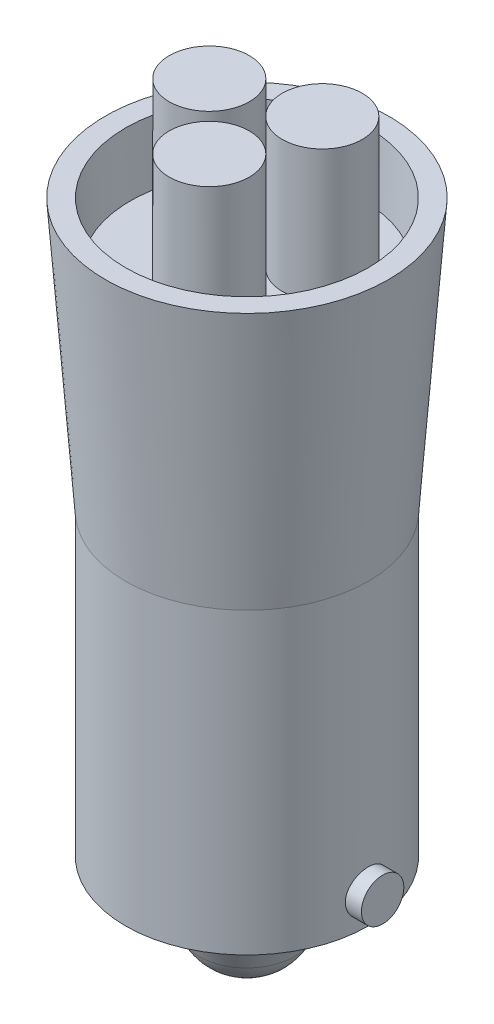
ISO-10303-21;
HEADER;
FILE_DESCRIPTION(('STEP AP214'),'2;1');
FILE_NAME('part.step','',(''),(''),'','','');
FILE_SCHEMA(('AUTOMOTIVE_DESIGN { 1 0 10303 214 1 1 1 1 }'));
ENDSEC;
DATA;
#1=APPLICATION_CONTEXT('core data for automotive mechanical design processes');
#2=APPLICATION_PROTOCOL_DEFINITION('international standard','automotive_design',2000,#1);
#3=PRODUCT_CONTEXT('',#1,'mechanical');
#4=PRODUCT('Part','Part','',(#3));
#5=PRODUCT_RELATED_PRODUCT_CATEGORY('part','',(#4));
#6=PRODUCT_DEFINITION_FORMATION('','',#4);
#7=PRODUCT_DEFINITION_CONTEXT('part definition',#1,'design');
#8=PRODUCT_DEFINITION('design','',#6,#7);
#9=PRODUCT_DEFINITION_SHAPE('','',#8);
#10=(LENGTH_UNIT() NAMED_UNIT(*) SI_UNIT(.MILLI.,.METRE.));
#11=(NAMED_UNIT(*) PLANE_ANGLE_UNIT() SI_UNIT($,.RADIAN.));
#12=(NAMED_UNIT(*) SI_UNIT($,.STERADIAN.) SOLID_ANGLE_UNIT());
#13=UNCERTAINTY_MEASURE_WITH_UNIT(LENGTH_MEASURE(1.E-05),#10,'distance_accuracy_value','');
#14=(GEOMETRIC_REPRESENTATION_CONTEXT(3) GLOBAL_UNCERTAINTY_ASSIGNED_CONTEXT((#13)) GLOBAL_UNIT_ASSIGNED_CONTEXT((#10,
#11,#12)) REPRESENTATION_CONTEXT('',''));
#15=CARTESIAN_POINT('',(0.,0.,0.));
#16=DIRECTION('',(0.,0.,1.));
#17=DIRECTION('',(1.,0.,0.));
#18=AXIS2_PLACEMENT_3D('',#15,#16,#17);
#19=CARTESIAN_POINT('',(0.,1.95438888888889,0.));
#20=DIRECTION('',(0.,-1.,0.));
#21=DIRECTION('',(1.,0.,0.));
#22=AXIS2_PLACEMENT_3D('',#19,#20,#21);
#23=SPHERICAL_SURFACE('',#22,1.95438888888889);
#24=CARTESIAN_POINT('',(0.,1.143,0.));
#25=DIRECTION('',(0.,-1.,0.));
#26=DIRECTION('',(1.,0.,0.));
#27=AXIS2_PLACEMENT_3D('',#24,#25,#26);
#28=CIRCLE('',#27,1.778);
#29=CARTESIAN_POINT('',(1.778,1.143,0.));
#30=VERTEX_POINT('',#29);
#31=EDGE_CURVE('E61',#30,#30,#28,.T.);
#32=ORIENTED_EDGE('',*,*,#31,.T.);
#33=EDGE_LOOP('',(#32));
#34=FACE_BOUND('',#33,.T.);
#35=ADVANCED_FACE('F46',(#34),#23,.T.);
#36=CARTESIAN_POINT('',(0.,1.143,0.));
#37=DIRECTION('',(0.,1.,0.));
#38=DIRECTION('',(-1.,0.,0.));
#39=AXIS2_PLACEMENT_3D('',#36,#37,#38);
#40=CONICAL_SURFACE('',#39,1.778,0.428121367127643);
#41=CARTESIAN_POINT('',(0.,3.52242782608695,0.));
#42=DIRECTION('',(0.,-1.,0.));
#43=DIRECTION('',(1.,0.,0.));
#44=AXIS2_PLACEMENT_3D('',#41,#42,#43);
#45=CIRCLE('',#44,2.86385);
#46=CARTESIAN_POINT('',(2.86385,3.52242782608695,0.));
#47=VERTEX_POINT('',#46);
#48=EDGE_CURVE('E65',#47,#47,#45,.T.);
#49=ORIENTED_EDGE('',*,*,#48,.T.);
#50=EDGE_LOOP('',(#49));
#51=FACE_BOUND('',#50,.T.);
#52=ORIENTED_EDGE('',*,*,#31,.F.);
#53=EDGE_LOOP('',(#52));
#54=FACE_BOUND('',#53,.T.);
#55=ADVANCED_FACE('F106',(#51,#54),#40,.T.);
#56=CARTESIAN_POINT('',(2.86385,3.52242782608695,0.));
#57=DIRECTION('',(0.,-1.,0.));
#58=DIRECTION('',(1.,0.,0.));
#59=AXIS2_PLACEMENT_3D('',#56,#57,#58);
#60=PLANE('',#59);
#61=CARTESIAN_POINT('',(0.,3.52242782608696,0.));
#62=DIRECTION('',(0.,-1.,0.));
#63=DIRECTION('',(1.,0.,0.));
#64=AXIS2_PLACEMENT_3D('',#61,#62,#63);
#65=CIRCLE('',#64,4.5466);
#66=CARTESIAN_POINT('',(4.5466,3.52242782608696,0.));
#67=VERTEX_POINT('',#66);
#68=EDGE_CURVE('E121',#67,#67,#65,.T.);
#69=ORIENTED_EDGE('',*,*,#68,.T.);
#70=EDGE_LOOP('',(#69));
#71=FACE_BOUND('',#70,.T.);
#72=ORIENTED_EDGE('',*,*,#48,.F.);
#73=EDGE_LOOP('',(#72));
#74=FACE_BOUND('',#73,.T.);
#75=ADVANCED_FACE('F101',(#71,#74),#60,.T.);
#76=CARTESIAN_POINT('',(0.,0.,0.));
#77=DIRECTION('',(0.,-1.,0.));
#78=DIRECTION('',(1.,0.,0.));
#79=AXIS2_PLACEMENT_3D('',#76,#77,#78);
#80=CYLINDRICAL_SURFACE('',#79,4.5466);
#81=CARTESIAN_POINT('',(4.5466,5.44012782608696,0.));
#82=CARTESIAN_POINT('',(4.54659922324783,5.44012608162063,0.0442250249032955));
#83=CARTESIAN_POINT('',(4.54594803133133,5.43641923840076,0.0884734012048862));
#84=CARTESIAN_POINT('',(4.54341302492451,5.42169720833523,0.175726972867044));
#85=CARTESIAN_POINT('',(4.54152811111363,5.41067550338421,0.218731023739012));
#86=CARTESIAN_POINT('',(4.53673687170384,5.38166846236315,0.302221125707039));
#87=CARTESIAN_POINT('',(4.533831413882,5.36368904118012,0.342709281773566));
#88=CARTESIAN_POINT('',(4.52731774457866,5.32129291521683,0.420089622096373));
#89=CARTESIAN_POINT('',(4.5237096048041,5.29687686718846,0.45698217269931));
#90=CARTESIAN_POINT('',(4.51614777031016,5.24202941751848,0.52651415097332));
#91=CARTESIAN_POINT('',(4.51219115887797,5.21154388271028,0.559110565254684));
#92=CARTESIAN_POINT('',(4.50440038948714,5.14553933108382,0.618753217870177));
#93=CARTESIAN_POINT('',(4.50056623964954,5.11001998129397,0.645799088762748));
#94=CARTESIAN_POINT('',(4.49342623634228,5.03465743927614,0.693747714487731));
#95=CARTESIAN_POINT('',(4.49012414915248,4.99478651000972,0.714607483966474));
#96=CARTESIAN_POINT('',(4.48446285941203,4.91203915589262,0.749316786034276));
#97=CARTESIAN_POINT('',(4.48210358678054,4.86916295470693,0.763166839686516));
#98=CARTESIAN_POINT('',(4.47862421455198,4.78207973428905,0.783327098096888));
#99=CARTESIAN_POINT('',(4.47749187201528,4.73789047108175,0.789711847269332));
#100=CARTESIAN_POINT('',(4.47655758159247,4.64905446898194,0.794991477676227));
#101=CARTESIAN_POINT('',(4.47675553039178,4.60440776588454,0.793886940551942));
#102=CARTESIAN_POINT('',(4.47844829003792,4.5164592621344,0.784279970392056));
#103=CARTESIAN_POINT('',(4.47992835519466,4.47314794813368,0.775861650359337));
#104=CARTESIAN_POINT('',(4.48399547110111,4.38856203315262,0.751998251472647));
#105=CARTESIAN_POINT('',(4.4865825631675,4.34728750825387,0.736552910353436));
#106=CARTESIAN_POINT('',(4.49258797369439,4.26769708811841,0.698989739805907));
#107=CARTESIAN_POINT('',(4.49601058090179,4.22939784692868,0.6768373369817));
#108=CARTESIAN_POINT('',(4.50329845652624,4.15702830647592,0.626513379335399));
#109=CARTESIAN_POINT('',(4.507163764042,4.12295838129512,0.598341292672226));
#110=CARTESIAN_POINT('',(4.5149661139714,4.05952803183575,0.536321133489116));
#111=CARTESIAN_POINT('',(4.51890341633733,4.03023807871959,0.502400973436666));
#112=CARTESIAN_POINT('',(4.52635755842187,3.9777545171418,0.430090387989798));
#113=CARTESIAN_POINT('',(4.52987439491966,3.95456095537761,0.391699928356807));
#114=CARTESIAN_POINT('',(4.5360970842096,3.91492069852613,0.311469594076049));
#115=CARTESIAN_POINT('',(4.53880213943552,3.89848063286502,0.269626378245453));
#116=CARTESIAN_POINT('',(4.54309017449456,3.87288157537405,0.18371481647558));
#117=CARTESIAN_POINT('',(4.54467325744453,3.86372191441637,0.139646675420871));
#118=CARTESIAN_POINT('',(4.54652500251656,3.85304014335398,0.0511431823313141));
#119=CARTESIAN_POINT('',(4.54681030095437,3.85142136012041,0.00671983432652004));
#120=CARTESIAN_POINT('',(4.54608003980088,3.85560898198229,-0.081763095262268));
#121=CARTESIAN_POINT('',(4.5450645353112,3.86141507256223,-0.125822692175087));
#122=CARTESIAN_POINT('',(4.54185709127998,3.88020722738448,-0.212025879221383));
#123=CARTESIAN_POINT('',(4.53967306011695,3.8931450430101,-0.254180307229593));
#124=CARTESIAN_POINT('',(4.53437243941824,3.92578167162564,-0.335721814238912));
#125=CARTESIAN_POINT('',(4.53125579336967,3.94548089434158,-0.375108725360445));
#126=CARTESIAN_POINT('',(4.52439426608312,3.99129982359044,-0.450414385286808));
#127=CARTESIAN_POINT('',(4.52064363303743,4.01747943612052,-0.486296150515035));
#128=CARTESIAN_POINT('',(4.51294652330586,4.07543409235994,-0.553191765844944));
#129=CARTESIAN_POINT('',(4.50900003093678,4.10720958467347,-0.584205225292476));
#130=CARTESIAN_POINT('',(4.50130168587646,4.17588912897366,-0.64084553531277));
#131=CARTESIAN_POINT('',(4.49755257088243,4.21284760854141,-0.666406821337915));
#132=CARTESIAN_POINT('',(4.49072601390306,4.29059066392463,-0.710958171721942));
#133=CARTESIAN_POINT('',(4.48764854918253,4.33137511016527,-0.729948458520203));
#134=CARTESIAN_POINT('',(4.48253462611315,4.41543525178207,-0.760722541876529));
#135=CARTESIAN_POINT('',(4.48049359732931,4.45869905656828,-0.772538023610782));
#136=CARTESIAN_POINT('',(4.47767253704911,4.54663617872278,-0.788726128939985));
#137=CARTESIAN_POINT('',(4.47689238413191,4.59130935994738,-0.793099469206353));
#138=CARTESIAN_POINT('',(4.47668698463974,4.68014171190251,-0.794257684920323));
#139=CARTESIAN_POINT('',(4.47724329833746,4.72429952710754,-0.791145835568231));
#140=CARTESIAN_POINT('',(4.47960756249878,4.81145272805102,-0.777646343446872));
#141=CARTESIAN_POINT('',(4.48141550772638,4.85444811865151,-0.767258731114581));
#142=CARTESIAN_POINT('',(4.48607203666772,4.93801031217768,-0.739543640157803));
#143=CARTESIAN_POINT('',(4.48891915997659,4.97858043078324,-0.722225897488753));
#144=CARTESIAN_POINT('',(4.49533450915951,5.05625607894352,-0.681152971844556));
#145=CARTESIAN_POINT('',(4.49890277644563,5.09336140935198,-0.657397419148067));
#146=CARTESIAN_POINT('',(4.50641637712314,5.16357437322571,-0.603758103310979));
#147=CARTESIAN_POINT('',(4.51036601120101,5.19662373328388,-0.573798651984888));
#148=CARTESIAN_POINT('',(4.51816381361638,5.25726102827667,-0.508761019059024));
#149=CARTESIAN_POINT('',(4.52201195838449,5.28484770409691,-0.473681660581892));
#150=CARTESIAN_POINT('',(4.52920751145243,5.33397128054542,-0.399079710453751));
#151=CARTESIAN_POINT('',(4.53255086099592,5.35546025219113,-0.359525160623355));
#152=CARTESIAN_POINT('',(4.53832062009217,5.39145475456677,-0.277323979595033));
#153=CARTESIAN_POINT('',(4.54074792346392,5.4059670964506,-0.23468041115469));
#154=CARTESIAN_POINT('',(4.54389507387389,5.42452043217856,-0.159904447442069));
#155=CARTESIAN_POINT('',(4.54490388821748,5.43036360448835,-0.128219133856251));
#156=CARTESIAN_POINT('',(4.54625662728281,5.43816789740605,-0.0643599964764766));
#157=CARTESIAN_POINT('',(4.54660056530634,5.44012909567836,-0.0321861824686428));
#158=CARTESIAN_POINT('',(4.5466,5.44012782608696,0.));
#159=B_SPLINE_CURVE_WITH_KNOTS('',3,(#81,#82,#83,#84,#85,#86,#87,#88,#89,#90,#91,#92,#93,#94,
#95,#96,#97,#98,#99,#100,#101,#102,#103,#104,#105,#106,#107,#108,#109,#110,#111,#112,#113,#114,
#115,#116,#117,#118,#119,#120,#121,#122,#123,#124,#125,#126,#127,#128,#129,#130,#131,#132,#133,
#134,#135,#136,#137,#138,#139,#140,#141,#142,#143,#144,#145,#146,#147,#148,#149,#150,#151,#152,
#153,#154,#155,#156,#157,#158),.UNSPECIFIED.,.T.,.F.,(4,2,2,2,2,2,2,2,2,2,2,2,2,2,2,2,2,2,2,2,2,
2,2,2,2,2,2,2,2,2,2,2,2,2,2,2,2,2,4),(0.,0.132557404364293,0.26523308646407,0.397796225343225,
0.530345843566623,0.664135375929921,0.797933762199028,0.932641187611499,1.06733859815398,
1.20067918653014,1.33400941938017,1.46582627155169,1.59764804384715,1.73016124353839,
1.86268615565952,1.99701623665783,2.13134734657443,2.2658100064792,2.40026030675313,
2.53298213841609,2.66569834820672,2.79752751429172,2.92936467033784,3.06246931415115,
3.19558463340926,3.33022023467607,3.4648512778553,3.59888335924527,3.7329025327378,
3.8650832378388,3.99726338998652,4.12925849403881,4.26126118013412,4.39498076684274,
4.52873113929092,4.66350539979579,4.79814781413386,4.89462265330171,4.99109556233383),.UNSPECIFIED.);
#160=CARTESIAN_POINT('',(4.5466,5.44012782608696,0.));
#161=VERTEX_POINT('',#160);
#162=EDGE_CURVE('E12',#161,#161,#159,.T.);
#163=ORIENTED_EDGE('',*,*,#162,.F.);
#164=EDGE_LOOP('',(#163));
#165=FACE_BOUND('',#164,.T.);
#166=CARTESIAN_POINT('',(-4.47677702119505,4.64637782608696,-0.79375));
#167=CARTESIAN_POINT('',(-4.47677784381179,4.60215859054283,-0.793748250782651));
#168=CARTESIAN_POINT('',(-4.47743928866573,4.55791598972541,-0.790042345225491));
#169=CARTESIAN_POINT('',(-4.48001086637375,4.47067441312001,-0.775324377272987));
#170=CARTESIAN_POINT('',(-4.48192211689087,4.42767658647025,-0.764305775224919));
#171=CARTESIAN_POINT('',(-4.48677039348191,4.34419965986668,-0.735307807291687));
#172=CARTESIAN_POINT('',(-4.48970652613431,4.30371840223401,-0.717334502559943));
#173=CARTESIAN_POINT('',(-4.49627268230497,4.2263496705626,-0.674952790415161));
#174=CARTESIAN_POINT('',(-4.49990263655136,4.1894618383071,-0.650545025333195));
#175=CARTESIAN_POINT('',(-4.50749124724984,4.11992473898399,-0.595706029485585));
#176=CARTESIAN_POINT('',(-4.5114527440396,4.08731993156293,-0.565218807940707));
#177=CARTESIAN_POINT('',(-4.51923290180924,4.02766102088494,-0.499207331677872));
#178=CARTESIAN_POINT('',(-4.52305155398555,4.00060725928198,-0.463682767150586));
#179=CARTESIAN_POINT('',(-4.53014596445286,3.95265021537505,-0.388315451284675));
#180=CARTESIAN_POINT('',(-4.53341799065492,3.93178851436761,-0.348445859987322));
#181=CARTESIAN_POINT('',(-4.53901880310131,3.89707527499098,-0.265701405769849));
#182=CARTESIAN_POINT('',(-4.54134765658978,3.88322323684539,-0.222826757353138));
#183=CARTESIAN_POINT('',(-4.54477966940923,3.8630590764613,-0.135749132109266));
#184=CARTESIAN_POINT('',(-4.54589498043325,3.85667215407162,-0.0915639631945839));
#185=CARTESIAN_POINT('',(-4.5468160426624,3.85138675757136,-0.00273603995280554));
#186=CARTESIAN_POINT('',(-4.54662189113655,3.85248772724794,0.0419066801406731));
#187=CARTESIAN_POINT('',(-4.54495547797133,3.86208888316304,0.129870469849214));
#188=CARTESIAN_POINT('',(-4.54349712451149,3.87050855508564,0.173200628817312));
#189=CARTESIAN_POINT('',(-4.53948170492227,3.89438112598726,0.257823528702428));
#190=CARTESIAN_POINT('',(-4.53692460283396,3.9098342551523,0.299116202889055));
#191=CARTESIAN_POINT('',(-4.53097547490532,3.9474138830472,0.378729263603714));
#192=CARTESIAN_POINT('',(-4.52757935931322,3.96957319364581,0.417033843923496));
#193=CARTESIAN_POINT('',(-4.52032888969491,4.01991207537924,0.489411167355114));
#194=CARTESIAN_POINT('',(-4.51647449508857,4.04809217982554,0.523483535161829));
#195=CARTESIAN_POINT('',(-4.50867496419006,4.11011824245396,0.586905455243336));
#196=CARTESIAN_POINT('',(-4.50472930290469,4.14403459976127,0.616186134891827));
#197=CARTESIAN_POINT('',(-4.49724132779351,4.21633419890809,0.668652767621618));
#198=CARTESIAN_POINT('',(-4.49369901842504,4.25471749010108,0.691838653354595));
#199=CARTESIAN_POINT('',(-4.48741835960985,4.33494544784942,0.731473289966851));
#200=CARTESIAN_POINT('',(-4.48468107583819,4.37679460941789,0.747913121841096));
#201=CARTESIAN_POINT('',(-4.4803375075457,4.46271915752552,0.773509910572997));
#202=CARTESIAN_POINT('',(-4.47873111309089,4.50679432722739,0.782667575342917));
#203=CARTESIAN_POINT('',(-4.47685265968716,4.59530176333537,0.793341791198638));
#204=CARTESIAN_POINT('',(-4.47656340826995,4.63972180166505,0.794956802583011));
#205=CARTESIAN_POINT('',(-4.47730611992737,4.72819722318944,0.790762818730819));
#206=CARTESIAN_POINT('',(-4.47833802677196,4.77225262182332,0.784954139455113));
#207=CARTESIAN_POINT('',(-4.48159085294255,4.85843143740398,0.7661618245868));
#208=CARTESIAN_POINT('',(-4.48380337277039,4.9005662477346,0.753228854160541));
#209=CARTESIAN_POINT('',(-4.48916101329229,4.98207064787054,0.720608439671508));
#210=CARTESIAN_POINT('',(-4.49230619460124,5.02144005774312,0.700920556585094));
#211=CARTESIAN_POINT('',(-4.49921443205922,5.0967326840625,0.65511892439148));
#212=CARTESIAN_POINT('',(-4.50298339637567,5.13261716606328,0.62894240775854));
#213=CARTESIAN_POINT('',(-4.5106974988399,5.1995196915454,0.570992157054485));
#214=CARTESIAN_POINT('',(-4.51464265061718,5.2305373576992,0.539217989398708));
#215=CARTESIAN_POINT('',(-4.52231931039342,5.28718835299364,0.470536860769636));
#216=CARTESIAN_POINT('',(-4.5260478474053,5.31275581371083,0.433575185681367));
#217=CARTESIAN_POINT('',(-4.53282268169075,5.35731798333362,0.355823938860209));
#218=CARTESIAN_POINT('',(-4.53586900264524,5.37631292039566,0.315034500065556));
#219=CARTESIAN_POINT('',(-4.5409233040252,5.4070897659729,0.230976228713226));
#220=CARTESIAN_POINT('',(-4.54293612688025,5.41890536180405,0.187720034091803));
#221=CARTESIAN_POINT('',(-4.54571718332665,5.43509626804649,0.0997990909437857));
#222=CARTESIAN_POINT('',(-4.54648552973366,5.43947225288349,0.0551344704696591));
#223=CARTESIAN_POINT('',(-4.54668922914222,5.44063881394921,-0.0337012267657496));
#224=CARTESIAN_POINT('',(-4.54614214576179,5.43752933542018,-0.0778709824054849));
#225=CARTESIAN_POINT('',(-4.5438125446256,5.42403041007572,-0.165048689043799));
#226=CARTESIAN_POINT('',(-4.54203003548906,5.41364101405017,-0.208056648145724));
#227=CARTESIAN_POINT('',(-4.53742937290998,5.3859169352667,-0.291646353761244));
#228=CARTESIAN_POINT('',(-4.53461260503462,5.36859154167712,-0.33223126218598));
#229=CARTESIAN_POINT('',(-4.52824996372134,5.32749869259911,-0.409933342676819));
#230=CARTESIAN_POINT('',(-4.52470405036568,5.30373088439205,-0.44705032472622));
#231=CARTESIAN_POINT('',(-4.51721960790266,5.250077309984,-0.51726447756357));
#232=CARTESIAN_POINT('',(-4.51327672068554,5.22011870193794,-0.550305528535763));
#233=CARTESIAN_POINT('',(-4.50547189165517,5.15508627534257,-0.610926450277944));
#234=CARTESIAN_POINT('',(-4.50160996902929,5.12001125961126,-0.638505039322258));
#235=CARTESIAN_POINT('',(-4.49437143578858,5.04541357793571,-0.687618963788423));
#236=CARTESIAN_POINT('',(-4.49099887382134,5.00585815244527,-0.709105148736958));
#237=CARTESIAN_POINT('',(-4.48516904393739,4.92365529825732,-0.745094205541834));
#238=CARTESIAN_POINT('',(-4.48271088052502,4.88101094380397,-0.759603913750598));
#239=CARTESIAN_POINT('',(-4.47952148226502,4.80624184325182,-0.778150547571793));
#240=CARTESIAN_POINT('',(-4.47849817239774,4.77456463023218,-0.783990726238948));
#241=CARTESIAN_POINT('',(-4.47712564970565,4.71072167086575,-0.791791047747243));
#242=CARTESIAN_POINT('',(-4.4767764225811,4.67855593489692,-0.79375127289641));
#243=CARTESIAN_POINT('',(-4.47677702119505,4.64637782608696,-0.79375));
#244=B_SPLINE_CURVE_WITH_KNOTS('',3,(#166,#167,#168,#169,#170,#171,#172,#173,#174,#175,#176,
#177,#178,#179,#180,#181,#182,#183,#184,#185,#186,#187,#188,#189,#190,#191,#192,#193,#194,#195,
#196,#197,#198,#199,#200,#201,#202,#203,#204,#205,#206,#207,#208,#209,#210,#211,#212,#213,#214,
#215,#216,#217,#218,#219,#220,#221,#222,#223,#224,#225,#226,#227,#228,#229,#230,#231,#232,#233,
#234,#235,#236,#237,#238,#239,#240,#241,#242,#243),.UNSPECIFIED.,.T.,.F.,(4,2,2,2,2,2,2,2,2,2,2,
2,2,2,2,2,2,2,2,2,2,2,2,2,2,2,2,2,2,2,2,2,2,2,2,2,2,2,4),(0.,0.132540006348164,
0.265198701566014,0.397742041707388,0.530272155488928,0.664084461184304,0.797905000247189,
0.932604840517269,1.06729507557666,1.20062382524731,1.33394267114895,1.46581315397515,
1.59768795287576,1.73021871420736,1.86276121975481,1.9970672968571,2.13137485799788,
2.26585942039381,2.40033090771027,2.53304203119269,2.66574750652436,2.79752119339331,
2.92930344628359,3.06241395960813,3.19553478798683,3.33018315353718,3.46482684447922,
3.59883377293748,3.73282855257003,3.86504419085174,3.9972589067122,4.12929714068397,
4.26134260513628,4.39504057647591,4.52876988197307,4.66354919937928,4.79819617400827,
4.89464689664567,4.99109557318802),.UNSPECIFIED.);
#245=CARTESIAN_POINT('',(-4.47677702119505,4.64637782608696,-0.79375));
#246=VERTEX_POINT('',#245);
#247=EDGE_CURVE('E57',#246,#246,#244,.T.);
#248=ORIENTED_EDGE('',*,*,#247,.F.);
#249=EDGE_LOOP('',(#248));
#250=FACE_BOUND('',#249,.T.);
#251=CARTESIAN_POINT('',(0.,14.698427826087,0.));
#252=DIRECTION('',(0.,-1.,0.));
#253=DIRECTION('',(1.,0.,0.));
#254=AXIS2_PLACEMENT_3D('',#251,#252,#253);
#255=CIRCLE('',#254,4.5466);
#256=CARTESIAN_POINT('',(4.5466,14.698427826087,0.));
#257=VERTEX_POINT('',#256);
#258=EDGE_CURVE('E123',#257,#257,#255,.T.);
#259=ORIENTED_EDGE('',*,*,#258,.T.);
#260=EDGE_LOOP('',(#259));
#261=FACE_BOUND('',#260,.T.);
#262=ORIENTED_EDGE('',*,*,#68,.F.);
#263=EDGE_LOOP('',(#262));
#264=FACE_BOUND('',#263,.T.);
#265=ADVANCED_FACE('F71',(#165,#250,#261,#264),#80,.T.);
#266=CARTESIAN_POINT('',(0.,14.698427826087,0.));
#267=DIRECTION('',(0.,1.,0.));
#268=DIRECTION('',(-1.,0.,0.));
#269=AXIS2_PLACEMENT_3D('',#266,#267,#268);
#270=CONICAL_SURFACE('',#269,4.5466,0.0742383147796282);
#271=CARTESIAN_POINT('',(0.,24.858427826087,0.));
#272=DIRECTION('',(0.,-1.,0.));
#273=DIRECTION('',(1.,0.,0.));
#274=AXIS2_PLACEMENT_3D('',#271,#272,#273);
#275=CIRCLE('',#274,5.30225);
#276=CARTESIAN_POINT('',(5.30225,24.858427826087,0.));
#277=VERTEX_POINT('',#276);
#278=EDGE_CURVE('E128',#277,#277,#275,.T.);
#279=ORIENTED_EDGE('',*,*,#278,.T.);
#280=EDGE_LOOP('',(#279));
#281=FACE_BOUND('',#280,.T.);
#282=ORIENTED_EDGE('',*,*,#258,.F.);
#283=EDGE_LOOP('',(#282));
#284=FACE_BOUND('',#283,.T.);
#285=ADVANCED_FACE('F94',(#281,#284),#270,.T.);
#286=CARTESIAN_POINT('',(5.30225,24.858427826087,0.));
#287=DIRECTION('',(0.,1.,0.));
#288=DIRECTION('',(-1.,0.,0.));
#289=AXIS2_PLACEMENT_3D('',#286,#287,#288);
#290=PLANE('',#289);
#291=CARTESIAN_POINT('',(0.,24.858427826087,0.));
#292=DIRECTION('',(0.,-1.,0.));
#293=DIRECTION('',(1.,0.,0.));
#294=AXIS2_PLACEMENT_3D('',#291,#292,#293);
#295=CIRCLE('',#294,4.54025);
#296=CARTESIAN_POINT('',(4.54025,24.858427826087,0.));
#297=VERTEX_POINT('',#296);
#298=EDGE_CURVE('E130',#297,#297,#295,.T.);
#299=ORIENTED_EDGE('',*,*,#298,.T.);
#300=EDGE_LOOP('',(#299));
#301=FACE_BOUND('',#300,.T.);
#302=ORIENTED_EDGE('',*,*,#278,.F.);
#303=EDGE_LOOP('',(#302));
#304=FACE_BOUND('',#303,.T.);
#305=ADVANCED_FACE('F91',(#301,#304),#290,.T.);
#306=CARTESIAN_POINT('',(0.,24.858427826087,0.));
#307=DIRECTION('',(0.,1.,0.));
#308=DIRECTION('',(-1.,0.,0.));
#309=AXIS2_PLACEMENT_3D('',#306,#307,#308);
#310=CONICAL_SURFACE('',#309,4.54025,0.0742383147796285);
#311=CARTESIAN_POINT('',(0.,22.572427826087,0.));
#312=DIRECTION('',(0.,-1.,0.));
#313=DIRECTION('',(1.,0.,0.));
#314=AXIS2_PLACEMENT_3D('',#311,#312,#313);
#315=CIRCLE('',#314,4.37022875);
#316=CARTESIAN_POINT('',(4.37022875,22.572427826087,0.));
#317=VERTEX_POINT('',#316);
#318=EDGE_CURVE('E133',#317,#317,#315,.T.);
#319=ORIENTED_EDGE('',*,*,#318,.T.);
#320=EDGE_LOOP('',(#319));
#321=FACE_BOUND('',#320,.T.);
#322=ORIENTED_EDGE('',*,*,#298,.F.);
#323=EDGE_LOOP('',(#322));
#324=FACE_BOUND('',#323,.T.);
#325=ADVANCED_FACE('F87',(#321,#324),#310,.F.);
#326=CARTESIAN_POINT('',(4.37022875,22.572427826087,0.));
#327=DIRECTION('',(0.,1.,0.));
#328=DIRECTION('',(-1.,0.,0.));
#329=AXIS2_PLACEMENT_3D('',#326,#327,#328);
#330=PLANE('',#329);
#331=CARTESIAN_POINT('',(0.516188385176211,22.572427826087,1.92644127975459));
#332=DIRECTION('',(0.,1.,0.));
#333=DIRECTION('',(0.,0.,1.));
#334=AXIS2_PLACEMENT_3D('',#331,#332,#333);
#335=CIRCLE('',#334,1.4986);
#336=CARTESIAN_POINT('',(0.516188385176211,22.572427826087,3.42504127975459));
#337=VERTEX_POINT('',#336);
#338=EDGE_CURVE('E157',#337,#337,#335,.T.);
#339=ORIENTED_EDGE('',*,*,#338,.F.);
#340=EDGE_LOOP('',(#339));
#341=FACE_BOUND('',#340,.T.);
#342=CARTESIAN_POINT('',(1.41025289457838,22.572427826087,-1.41025289457836));
#343=DIRECTION('',(0.,1.,0.));
#344=DIRECTION('',(0.,0.,1.));
#345=AXIS2_PLACEMENT_3D('',#342,#343,#344);
#346=CIRCLE('',#345,1.4986);
#347=CARTESIAN_POINT('',(1.41025289457838,22.572427826087,0.0883471054216403));
#348=VERTEX_POINT('',#347);
#349=EDGE_CURVE('E151',#348,#348,#346,.T.);
#350=ORIENTED_EDGE('',*,*,#349,.F.);
#351=EDGE_LOOP('',(#350));
#352=FACE_BOUND('',#351,.T.);
#353=CARTESIAN_POINT('',(-1.92644127975459,22.572427826087,-0.516188385176231));
#354=DIRECTION('',(0.,1.,0.));
#355=DIRECTION('',(0.,0.,1.));
#356=AXIS2_PLACEMENT_3D('',#353,#354,#355);
#357=CIRCLE('',#356,1.4986);
#358=CARTESIAN_POINT('',(-1.92644127975459,22.572427826087,0.982411614823769));
#359=VERTEX_POINT('',#358);
#360=EDGE_CURVE('E145',#359,#359,#357,.T.);
#361=ORIENTED_EDGE('',*,*,#360,.F.);
#362=EDGE_LOOP('',(#361));
#363=FACE_BOUND('',#362,.T.);
#364=ORIENTED_EDGE('',*,*,#318,.F.);
#365=EDGE_LOOP('',(#364));
#366=FACE_BOUND('',#365,.T.);
#367=ADVANCED_FACE('F83',(#341,#352,#363,#366),#330,.T.);
#368=CARTESIAN_POINT('',(-5.08,4.64637782608696,0.));
#369=DIRECTION('',(1.,0.,0.));
#370=DIRECTION('',(0.,0.,-1.));
#371=AXIS2_PLACEMENT_3D('',#368,#369,#370);
#372=PLANE('',#371);
#373=CARTESIAN_POINT('',(-5.08,4.64637782608696,0.));
#374=DIRECTION('',(1.,0.,0.));
#375=DIRECTION('',(0.,0.,-1.));
#376=AXIS2_PLACEMENT_3D('',#373,#374,#375);
#377=CIRCLE('',#376,0.79375);
#378=CARTESIAN_POINT('',(-5.08,4.64637782608696,-0.79375));
#379=VERTEX_POINT('',#378);
#380=EDGE_CURVE('E136',#379,#379,#377,.T.);
#381=ORIENTED_EDGE('',*,*,#380,.F.);
#382=EDGE_LOOP('',(#381));
#383=FACE_BOUND('',#382,.T.);
#384=ADVANCED_FACE('F81',(#383),#372,.F.);
#385=CARTESIAN_POINT('',(-5.08,4.64637782608696,0.));
#386=DIRECTION('',(1.,0.,0.));
#387=DIRECTION('',(0.,0.,-1.));
#388=AXIS2_PLACEMENT_3D('',#385,#386,#387);
#389=CYLINDRICAL_SURFACE('',#388,0.79375);
#390=ORIENTED_EDGE('',*,*,#247,.T.);
#391=EDGE_LOOP('',(#390));
#392=FACE_BOUND('',#391,.T.);
#393=ORIENTED_EDGE('',*,*,#380,.T.);
#394=EDGE_LOOP('',(#393));
#395=FACE_BOUND('',#394,.T.);
#396=ADVANCED_FACE('F75',(#392,#395),#389,.T.);
#397=ORIENTED_EDGE('',*,*,#162,.T.);
#398=EDGE_LOOP('',(#397));
#399=FACE_BOUND('',#398,.T.);
#400=CARTESIAN_POINT('',(5.08,4.64637782608696,0.));
#401=DIRECTION('',(1.,0.,0.));
#402=DIRECTION('',(0.,0.,-1.));
#403=AXIS2_PLACEMENT_3D('',#400,#401,#402);
#404=CIRCLE('',#403,0.79375);
#405=CARTESIAN_POINT('',(5.08,4.64637782608696,-0.79375));
#406=VERTEX_POINT('',#405);
#407=EDGE_CURVE('E139',#406,#406,#404,.T.);
#408=ORIENTED_EDGE('',*,*,#407,.F.);
#409=EDGE_LOOP('',(#408));
#410=FACE_BOUND('',#409,.T.);
#411=ADVANCED_FACE('F80',(#399,#410),#389,.T.);
#412=CARTESIAN_POINT('',(5.08,4.64637782608696,0.));
#413=DIRECTION('',(1.,0.,0.));
#414=DIRECTION('',(0.,0.,-1.));
#415=AXIS2_PLACEMENT_3D('',#412,#413,#414);
#416=PLANE('',#415);
#417=ORIENTED_EDGE('',*,*,#407,.T.);
#418=EDGE_LOOP('',(#417));
#419=FACE_BOUND('',#418,.T.);
#420=ADVANCED_FACE('F178',(#419),#416,.T.);
#421=CARTESIAN_POINT('',(-1.92644127975459,34.3803087152316,-0.516188385176231));
#422=DIRECTION('',(0.,-1.,0.));
#423=DIRECTION('',(1.,0.,0.));
#424=AXIS2_PLACEMENT_3D('',#421,#422,#423);
#425=CYLINDRICAL_SURFACE('',#424,1.4986);
#426=ORIENTED_EDGE('',*,*,#360,.T.);
#427=EDGE_LOOP('',(#426));
#428=FACE_BOUND('',#427,.T.);
#429=CARTESIAN_POINT('',(-1.92644127975459,27.500027826087,-0.516188385176231));
#430=DIRECTION('',(0.,1.,0.));
#431=DIRECTION('',(-1.,0.,0.));
#432=AXIS2_PLACEMENT_3D('',#429,#430,#431);
#433=CIRCLE('',#432,1.4986);
#434=CARTESIAN_POINT('',(-3.42504127975459,27.500027826087,-0.516188385176231));
#435=VERTEX_POINT('',#434);
#436=EDGE_CURVE('E142',#435,#435,#433,.T.);
#437=ORIENTED_EDGE('',*,*,#436,.F.);
#438=EDGE_LOOP('',(#437));
#439=FACE_BOUND('',#438,.T.);
#440=ADVANCED_FACE('F174',(#428,#439),#425,.T.);
#441=CARTESIAN_POINT('',(5.30225,27.500027826087,0.));
#442=DIRECTION('',(0.,1.,0.));
#443=DIRECTION('',(-1.,0.,0.));
#444=AXIS2_PLACEMENT_3D('',#441,#442,#443);
#445=PLANE('',#444);
#446=ORIENTED_EDGE('',*,*,#436,.T.);
#447=EDGE_LOOP('',(#446));
#448=FACE_BOUND('',#447,.T.);
#449=ADVANCED_FACE('F177',(#448),#445,.T.);
#450=CARTESIAN_POINT('',(1.41025289457838,34.3803087152316,-1.41025289457836));
#451=DIRECTION('',(0.,-1.,0.));
#452=DIRECTION('',(1.,0.,0.));
#453=AXIS2_PLACEMENT_3D('',#450,#451,#452);
#454=CYLINDRICAL_SURFACE('',#453,1.4986);
#455=ORIENTED_EDGE('',*,*,#349,.T.);
#456=EDGE_LOOP('',(#455));
#457=FACE_BOUND('',#456,.T.);
#458=CARTESIAN_POINT('',(1.41025289457838,27.500027826087,-1.41025289457836));
#459=DIRECTION('',(0.,1.,0.));
#460=DIRECTION('',(-1.,0.,0.));
#461=AXIS2_PLACEMENT_3D('',#458,#459,#460);
#462=CIRCLE('',#461,1.4986);
#463=CARTESIAN_POINT('',(-0.0883471054216255,27.500027826087,-1.41025289457836));
#464=VERTEX_POINT('',#463);
#465=EDGE_CURVE('E148',#464,#464,#462,.T.);
#466=ORIENTED_EDGE('',*,*,#465,.F.);
#467=EDGE_LOOP('',(#466));
#468=FACE_BOUND('',#467,.T.);
#469=ADVANCED_FACE('F183',(#457,#468),#454,.T.);
#470=CARTESIAN_POINT('',(5.30225,27.500027826087,0.));
#471=DIRECTION('',(0.,1.,0.));
#472=DIRECTION('',(-1.,0.,0.));
#473=AXIS2_PLACEMENT_3D('',#470,#471,#472);
#474=PLANE('',#473);
#475=ORIENTED_EDGE('',*,*,#465,.T.);
#476=EDGE_LOOP('',(#475));
#477=FACE_BOUND('',#476,.T.);
#478=ADVANCED_FACE('F188',(#477),#474,.T.);
#479=CARTESIAN_POINT('',(0.516188385176211,34.3803087152316,1.92644127975459));
#480=DIRECTION('',(0.,-1.,0.));
#481=DIRECTION('',(1.,0.,0.));
#482=AXIS2_PLACEMENT_3D('',#479,#480,#481);
#483=CYLINDRICAL_SURFACE('',#482,1.4986);
#484=ORIENTED_EDGE('',*,*,#338,.T.);
#485=EDGE_LOOP('',(#484));
#486=FACE_BOUND('',#485,.T.);
#487=CARTESIAN_POINT('',(0.516188385176211,27.500027826087,1.92644127975459));
#488=DIRECTION('',(0.,1.,0.));
#489=DIRECTION('',(-1.,0.,0.));
#490=AXIS2_PLACEMENT_3D('',#487,#488,#489);
#491=CIRCLE('',#490,1.4986);
#492=CARTESIAN_POINT('',(-0.982411614823789,27.500027826087,1.92644127975459));
#493=VERTEX_POINT('',#492);
#494=EDGE_CURVE('E154',#493,#493,#491,.T.);
#495=ORIENTED_EDGE('',*,*,#494,.F.);
#496=EDGE_LOOP('',(#495));
#497=FACE_BOUND('',#496,.T.);
#498=ADVANCED_FACE('F161',(#486,#497),#483,.T.);
#499=CARTESIAN_POINT('',(5.30225,27.500027826087,0.));
#500=DIRECTION('',(0.,1.,0.));
#501=DIRECTION('',(-1.,0.,0.));
#502=AXIS2_PLACEMENT_3D('',#499,#500,#501);
#503=PLANE('',#502);
#504=ORIENTED_EDGE('',*,*,#494,.T.);
#505=EDGE_LOOP('',(#504));
#506=FACE_BOUND('',#505,.T.);
#507=ADVANCED_FACE('F305',(#506),#503,.T.);
#508=CLOSED_SHELL('',(#35,#55,#75,#265,#285,#305,#325,#367,#384,#396,#411,#420,#440,#449,#469,
#478,#498,#507));
#509=MANIFOLD_SOLID_BREP('B2',#508);
#510=ADVANCED_BREP_SHAPE_REPRESENTATION('',(#18,#509),#14);
#511=SHAPE_DEFINITION_REPRESENTATION(#9,#510);
ENDSEC;
END-ISO-10303-21;
